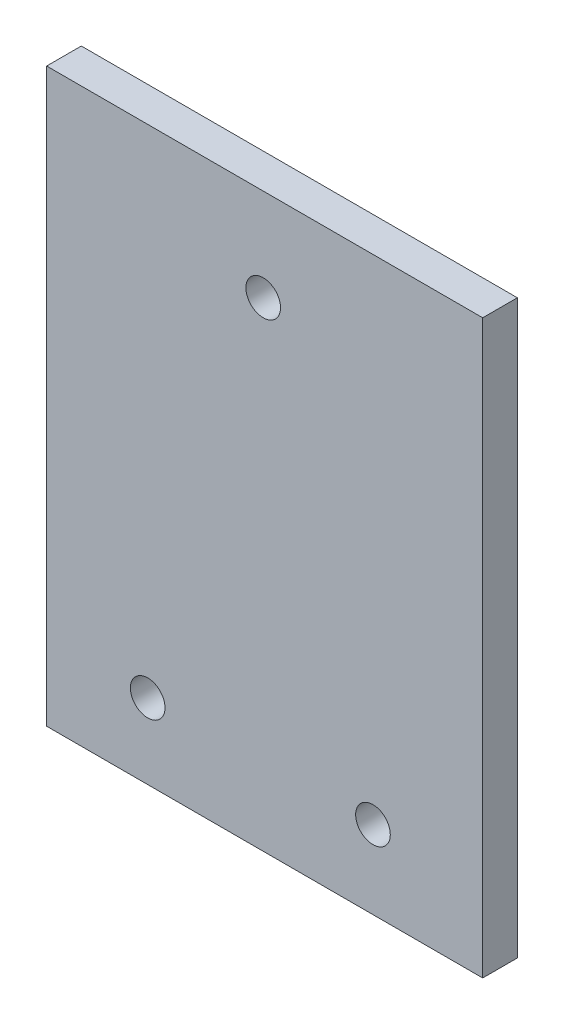
ISO-10303-21;
HEADER;
FILE_DESCRIPTION(('STEP AP214'),'2;1');
FILE_NAME('part.step','',(''),(''),'','','');
FILE_SCHEMA(('AUTOMOTIVE_DESIGN { 1 0 10303 214 1 1 1 1 }'));
ENDSEC;
DATA;
#1=APPLICATION_CONTEXT('core data for automotive mechanical design processes');
#2=APPLICATION_PROTOCOL_DEFINITION('international standard','automotive_design',2000,#1);
#3=PRODUCT_CONTEXT('',#1,'mechanical');
#4=PRODUCT('Part','Part','',(#3));
#5=PRODUCT_RELATED_PRODUCT_CATEGORY('part','',(#4));
#6=PRODUCT_DEFINITION_FORMATION('','',#4);
#7=PRODUCT_DEFINITION_CONTEXT('part definition',#1,'design');
#8=PRODUCT_DEFINITION('design','',#6,#7);
#9=PRODUCT_DEFINITION_SHAPE('','',#8);
#10=(LENGTH_UNIT() NAMED_UNIT(*) SI_UNIT(.MILLI.,.METRE.));
#11=(NAMED_UNIT(*) PLANE_ANGLE_UNIT() SI_UNIT($,.RADIAN.));
#12=(NAMED_UNIT(*) SI_UNIT($,.STERADIAN.) SOLID_ANGLE_UNIT());
#13=UNCERTAINTY_MEASURE_WITH_UNIT(LENGTH_MEASURE(1.E-05),#10,'distance_accuracy_value','');
#14=(GEOMETRIC_REPRESENTATION_CONTEXT(3) GLOBAL_UNCERTAINTY_ASSIGNED_CONTEXT((#13)) GLOBAL_UNIT_ASSIGNED_CONTEXT((#10,
#11,#12)) REPRESENTATION_CONTEXT('',''));
#15=CARTESIAN_POINT('',(0.,0.,0.));
#16=DIRECTION('',(0.,0.,1.));
#17=DIRECTION('',(1.,0.,0.));
#18=AXIS2_PLACEMENT_3D('',#15,#16,#17);
#19=CARTESIAN_POINT('',(0.,0.,12.));
#20=DIRECTION('',(1.,0.,0.));
#21=DIRECTION('',(0.,0.,-1.));
#22=AXIS2_PLACEMENT_3D('',#19,#20,#21);
#23=PLANE('',#22);
#24=DIRECTION('',(0.,-1.,0.));
#25=VECTOR('',#24,1.);
#26=CARTESIAN_POINT('',(0.,0.,0.));
#27=LINE('',#26,#25);
#28=CARTESIAN_POINT('',(0.,0.,0.));
#29=VERTEX_POINT('',#28);
#30=CARTESIAN_POINT('',(0.,-198.,0.));
#31=VERTEX_POINT('',#30);
#32=EDGE_CURVE('E98',#29,#31,#27,.T.);
#33=ORIENTED_EDGE('',*,*,#32,.T.);
#34=DIRECTION('',(0.,0.,-1.));
#35=VECTOR('',#34,1.);
#36=CARTESIAN_POINT('',(0.,-198.,12.));
#37=LINE('',#36,#35);
#38=CARTESIAN_POINT('',(0.,-198.,12.));
#39=VERTEX_POINT('',#38);
#40=EDGE_CURVE('E11',#39,#31,#37,.T.);
#41=ORIENTED_EDGE('',*,*,#40,.F.);
#42=DIRECTION('',(0.,-1.,0.));
#43=VECTOR('',#42,1.);
#44=CARTESIAN_POINT('',(0.,0.,12.));
#45=LINE('',#44,#43);
#46=CARTESIAN_POINT('',(0.,0.,12.));
#47=VERTEX_POINT('',#46);
#48=EDGE_CURVE('E86',#47,#39,#45,.T.);
#49=ORIENTED_EDGE('',*,*,#48,.F.);
#50=DIRECTION('',(0.,0.,-1.));
#51=VECTOR('',#50,1.);
#52=CARTESIAN_POINT('',(0.,0.,12.));
#53=LINE('',#52,#51);
#54=EDGE_CURVE('E94',#47,#29,#53,.T.);
#55=ORIENTED_EDGE('',*,*,#54,.T.);
#56=EDGE_LOOP('',(#33,#41,#49,#55));
#57=FACE_BOUND('',#56,.T.);
#58=ADVANCED_FACE('F35',(#57),#23,.F.);
#59=CARTESIAN_POINT('',(0.,-198.,12.));
#60=DIRECTION('',(0.,1.,0.));
#61=DIRECTION('',(0.,0.,1.));
#62=AXIS2_PLACEMENT_3D('',#59,#60,#61);
#63=PLANE('',#62);
#64=DIRECTION('',(1.,0.,0.));
#65=VECTOR('',#64,1.);
#66=CARTESIAN_POINT('',(0.,-198.,0.));
#67=LINE('',#66,#65);
#68=CARTESIAN_POINT('',(151.,-198.,0.));
#69=VERTEX_POINT('',#68);
#70=EDGE_CURVE('E90',#31,#69,#67,.T.);
#71=ORIENTED_EDGE('',*,*,#70,.T.);
#72=DIRECTION('',(0.,0.,-1.));
#73=VECTOR('',#72,1.);
#74=CARTESIAN_POINT('',(151.,-198.,12.));
#75=LINE('',#74,#73);
#76=CARTESIAN_POINT('',(151.,-198.,12.));
#77=VERTEX_POINT('',#76);
#78=EDGE_CURVE('E43',#77,#69,#75,.T.);
#79=ORIENTED_EDGE('',*,*,#78,.F.);
#80=DIRECTION('',(1.,0.,0.));
#81=VECTOR('',#80,1.);
#82=CARTESIAN_POINT('',(0.,-198.,12.));
#83=LINE('',#82,#81);
#84=EDGE_CURVE('E81',#39,#77,#83,.T.);
#85=ORIENTED_EDGE('',*,*,#84,.F.);
#86=ORIENTED_EDGE('',*,*,#40,.T.);
#87=EDGE_LOOP('',(#71,#79,#85,#86));
#88=FACE_BOUND('',#87,.T.);
#89=ADVANCED_FACE('F89',(#88),#63,.F.);
#90=CARTESIAN_POINT('',(151.,0.,12.));
#91=DIRECTION('',(-1.,0.,0.));
#92=DIRECTION('',(0.,-1.,0.));
#93=AXIS2_PLACEMENT_3D('',#90,#91,#92);
#94=PLANE('',#93);
#95=DIRECTION('',(0.,1.,0.));
#96=VECTOR('',#95,1.);
#97=CARTESIAN_POINT('',(151.,0.,0.));
#98=LINE('',#97,#96);
#99=CARTESIAN_POINT('',(151.,0.,0.));
#100=VERTEX_POINT('',#99);
#101=EDGE_CURVE('E68',#69,#100,#98,.T.);
#102=ORIENTED_EDGE('',*,*,#101,.T.);
#103=DIRECTION('',(0.,0.,-1.));
#104=VECTOR('',#103,1.);
#105=CARTESIAN_POINT('',(151.,0.,12.));
#106=LINE('',#105,#104);
#107=CARTESIAN_POINT('',(151.,0.,12.));
#108=VERTEX_POINT('',#107);
#109=EDGE_CURVE('E91',#108,#100,#106,.T.);
#110=ORIENTED_EDGE('',*,*,#109,.F.);
#111=DIRECTION('',(0.,1.,0.));
#112=VECTOR('',#111,1.);
#113=CARTESIAN_POINT('',(151.,0.,12.));
#114=LINE('',#113,#112);
#115=EDGE_CURVE('E84',#77,#108,#114,.T.);
#116=ORIENTED_EDGE('',*,*,#115,.F.);
#117=ORIENTED_EDGE('',*,*,#78,.T.);
#118=EDGE_LOOP('',(#102,#110,#116,#117));
#119=FACE_BOUND('',#118,.T.);
#120=ADVANCED_FACE('F92',(#119),#94,.F.);
#121=CARTESIAN_POINT('',(0.,0.,12.));
#122=DIRECTION('',(0.,-1.,0.));
#123=DIRECTION('',(0.,0.,-1.));
#124=AXIS2_PLACEMENT_3D('',#121,#122,#123);
#125=PLANE('',#124);
#126=DIRECTION('',(-1.,0.,0.));
#127=VECTOR('',#126,1.);
#128=CARTESIAN_POINT('',(0.,0.,0.));
#129=LINE('',#128,#127);
#130=EDGE_CURVE('E74',#100,#29,#129,.T.);
#131=ORIENTED_EDGE('',*,*,#130,.T.);
#132=ORIENTED_EDGE('',*,*,#54,.F.);
#133=DIRECTION('',(-1.,0.,0.));
#134=VECTOR('',#133,1.);
#135=CARTESIAN_POINT('',(0.,0.,12.));
#136=LINE('',#135,#134);
#137=EDGE_CURVE('E51',#108,#47,#136,.T.);
#138=ORIENTED_EDGE('',*,*,#137,.F.);
#139=ORIENTED_EDGE('',*,*,#109,.T.);
#140=EDGE_LOOP('',(#131,#132,#138,#139));
#141=FACE_BOUND('',#140,.T.);
#142=ADVANCED_FACE('F106',(#141),#125,.F.);
#143=CARTESIAN_POINT('',(0.,0.,12.));
#144=DIRECTION('',(0.,0.,1.));
#145=DIRECTION('',(1.,0.,0.));
#146=AXIS2_PLACEMENT_3D('',#143,#144,#145);
#147=PLANE('',#146);
#148=CARTESIAN_POINT('',(75.,-32.,12.));
#149=DIRECTION('',(0.,0.,1.));
#150=DIRECTION('',(1.,0.,0.));
#151=AXIS2_PLACEMENT_3D('',#148,#149,#150);
#152=CIRCLE('',#151,6.);
#153=CARTESIAN_POINT('',(81.,-32.,12.));
#154=VERTEX_POINT('',#153);
#155=EDGE_CURVE('E124',#154,#154,#152,.T.);
#156=ORIENTED_EDGE('',*,*,#155,.F.);
#157=EDGE_LOOP('',(#156));
#158=FACE_BOUND('',#157,.T.);
#159=CARTESIAN_POINT('',(35.,-172.,12.));
#160=DIRECTION('',(0.,0.,1.));
#161=DIRECTION('',(1.,0.,0.));
#162=AXIS2_PLACEMENT_3D('',#159,#160,#161);
#163=CIRCLE('',#162,6.00000000000001);
#164=CARTESIAN_POINT('',(41.,-172.,12.));
#165=VERTEX_POINT('',#164);
#166=EDGE_CURVE('E118',#165,#165,#163,.T.);
#167=ORIENTED_EDGE('',*,*,#166,.F.);
#168=EDGE_LOOP('',(#167));
#169=FACE_BOUND('',#168,.T.);
#170=CARTESIAN_POINT('',(113.,-171.,12.));
#171=DIRECTION('',(0.,0.,1.));
#172=DIRECTION('',(1.,0.,0.));
#173=AXIS2_PLACEMENT_3D('',#170,#171,#172);
#174=CIRCLE('',#173,6.);
#175=CARTESIAN_POINT('',(119.,-171.,12.));
#176=VERTEX_POINT('',#175);
#177=EDGE_CURVE('E112',#176,#176,#174,.T.);
#178=ORIENTED_EDGE('',*,*,#177,.F.);
#179=EDGE_LOOP('',(#178));
#180=FACE_BOUND('',#179,.T.);
#181=ORIENTED_EDGE('',*,*,#48,.T.);
#182=ORIENTED_EDGE('',*,*,#84,.T.);
#183=ORIENTED_EDGE('',*,*,#115,.T.);
#184=ORIENTED_EDGE('',*,*,#137,.T.);
#185=EDGE_LOOP('',(#181,#182,#183,#184));
#186=FACE_BOUND('',#185,.T.);
#187=ADVANCED_FACE('F82',(#158,#169,#180,#186),#147,.T.);
#188=CARTESIAN_POINT('',(0.,0.,0.));
#189=DIRECTION('',(0.,0.,1.));
#190=DIRECTION('',(1.,0.,0.));
#191=AXIS2_PLACEMENT_3D('',#188,#189,#190);
#192=PLANE('',#191);
#193=CARTESIAN_POINT('',(75.,-32.,0.));
#194=DIRECTION('',(0.,0.,1.));
#195=DIRECTION('',(1.,0.,0.));
#196=AXIS2_PLACEMENT_3D('',#193,#194,#195);
#197=CIRCLE('',#196,6.);
#198=CARTESIAN_POINT('',(81.,-32.,0.));
#199=VERTEX_POINT('',#198);
#200=EDGE_CURVE('E101',#199,#199,#197,.T.);
#201=ORIENTED_EDGE('',*,*,#200,.T.);
#202=EDGE_LOOP('',(#201));
#203=FACE_BOUND('',#202,.T.);
#204=CARTESIAN_POINT('',(35.,-172.,0.));
#205=DIRECTION('',(0.,0.,1.));
#206=DIRECTION('',(1.,0.,0.));
#207=AXIS2_PLACEMENT_3D('',#204,#205,#206);
#208=CIRCLE('',#207,6.00000000000001);
#209=CARTESIAN_POINT('',(41.,-172.,0.));
#210=VERTEX_POINT('',#209);
#211=EDGE_CURVE('E121',#210,#210,#208,.T.);
#212=ORIENTED_EDGE('',*,*,#211,.T.);
#213=EDGE_LOOP('',(#212));
#214=FACE_BOUND('',#213,.T.);
#215=CARTESIAN_POINT('',(113.,-171.,0.));
#216=DIRECTION('',(0.,0.,1.));
#217=DIRECTION('',(1.,0.,0.));
#218=AXIS2_PLACEMENT_3D('',#215,#216,#217);
#219=CIRCLE('',#218,6.);
#220=CARTESIAN_POINT('',(119.,-171.,0.));
#221=VERTEX_POINT('',#220);
#222=EDGE_CURVE('E115',#221,#221,#219,.T.);
#223=ORIENTED_EDGE('',*,*,#222,.T.);
#224=EDGE_LOOP('',(#223));
#225=FACE_BOUND('',#224,.T.);
#226=ORIENTED_EDGE('',*,*,#32,.F.);
#227=ORIENTED_EDGE('',*,*,#130,.F.);
#228=ORIENTED_EDGE('',*,*,#101,.F.);
#229=ORIENTED_EDGE('',*,*,#70,.F.);
#230=EDGE_LOOP('',(#226,#227,#228,#229));
#231=FACE_BOUND('',#230,.T.);
#232=ADVANCED_FACE('F109',(#203,#214,#225,#231),#192,.F.);
#233=CARTESIAN_POINT('',(113.,-171.,0.));
#234=DIRECTION('',(0.,0.,1.));
#235=DIRECTION('',(1.,0.,0.));
#236=AXIS2_PLACEMENT_3D('',#233,#234,#235);
#237=CYLINDRICAL_SURFACE('',#236,6.);
#238=ORIENTED_EDGE('',*,*,#222,.F.);
#239=EDGE_LOOP('',(#238));
#240=FACE_BOUND('',#239,.T.);
#241=ORIENTED_EDGE('',*,*,#177,.T.);
#242=EDGE_LOOP('',(#241));
#243=FACE_BOUND('',#242,.T.);
#244=ADVANCED_FACE('F146',(#240,#243),#237,.F.);
#245=CARTESIAN_POINT('',(35.,-172.,0.));
#246=DIRECTION('',(0.,0.,1.));
#247=DIRECTION('',(1.,0.,0.));
#248=AXIS2_PLACEMENT_3D('',#245,#246,#247);
#249=CYLINDRICAL_SURFACE('',#248,6.00000000000001);
#250=ORIENTED_EDGE('',*,*,#211,.F.);
#251=EDGE_LOOP('',(#250));
#252=FACE_BOUND('',#251,.T.);
#253=ORIENTED_EDGE('',*,*,#166,.T.);
#254=EDGE_LOOP('',(#253));
#255=FACE_BOUND('',#254,.T.);
#256=ADVANCED_FACE('F135',(#252,#255),#249,.F.);
#257=CARTESIAN_POINT('',(75.,-32.,0.));
#258=DIRECTION('',(0.,0.,1.));
#259=DIRECTION('',(1.,0.,0.));
#260=AXIS2_PLACEMENT_3D('',#257,#258,#259);
#261=CYLINDRICAL_SURFACE('',#260,6.);
#262=ORIENTED_EDGE('',*,*,#200,.F.);
#263=EDGE_LOOP('',(#262));
#264=FACE_BOUND('',#263,.T.);
#265=ORIENTED_EDGE('',*,*,#155,.T.);
#266=EDGE_LOOP('',(#265));
#267=FACE_BOUND('',#266,.T.);
#268=ADVANCED_FACE('F132',(#264,#267),#261,.F.);
#269=CLOSED_SHELL('',(#58,#89,#120,#142,#187,#232,#244,#256,#268));
#270=MANIFOLD_SOLID_BREP('B2',#269);
#271=ADVANCED_BREP_SHAPE_REPRESENTATION('',(#18,#270),#14);
#272=SHAPE_DEFINITION_REPRESENTATION(#9,#271);
ENDSEC;
END-ISO-10303-21;
